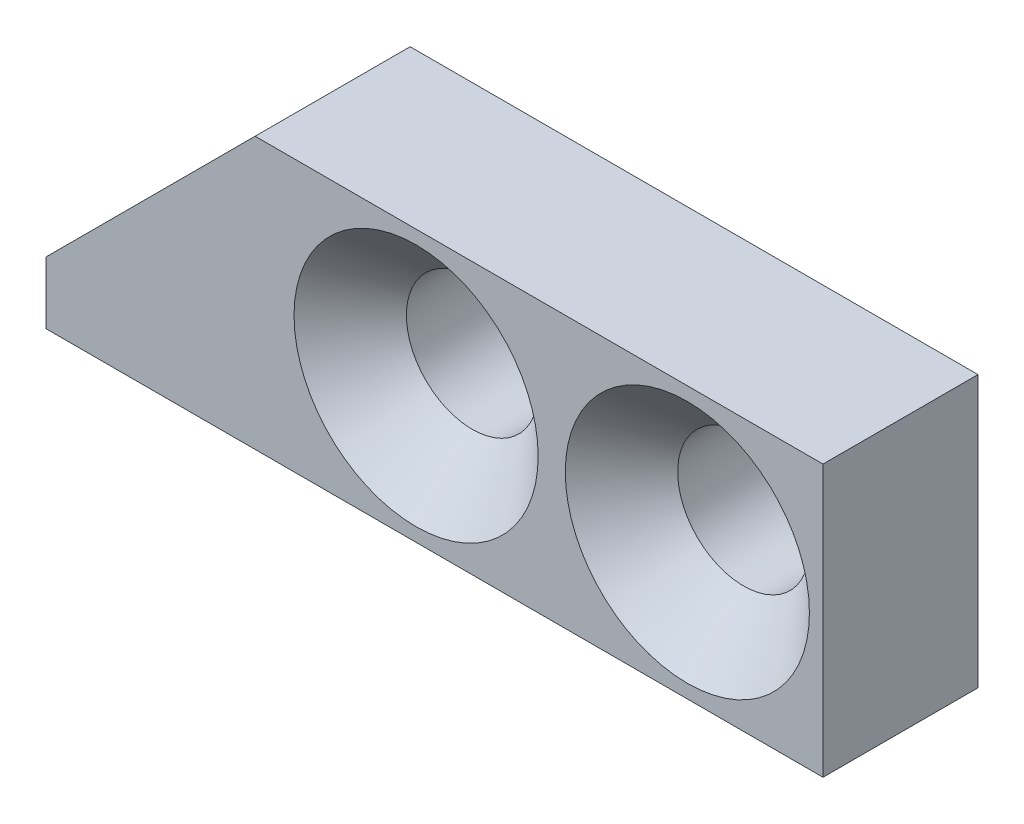
ISO-10303-21;
HEADER;
FILE_DESCRIPTION(('STEP AP214'),'2;1');
FILE_NAME('part.step','',(''),(''),'','','');
FILE_SCHEMA(('AUTOMOTIVE_DESIGN { 1 0 10303 214 1 1 1 1 }'));
ENDSEC;
DATA;
#1=APPLICATION_CONTEXT('core data for automotive mechanical design processes');
#2=APPLICATION_PROTOCOL_DEFINITION('international standard','automotive_design',2000,#1);
#3=PRODUCT_CONTEXT('',#1,'mechanical');
#4=PRODUCT('Part','Part','',(#3));
#5=PRODUCT_RELATED_PRODUCT_CATEGORY('part','',(#4));
#6=PRODUCT_DEFINITION_FORMATION('','',#4);
#7=PRODUCT_DEFINITION_CONTEXT('part definition',#1,'design');
#8=PRODUCT_DEFINITION('design','',#6,#7);
#9=PRODUCT_DEFINITION_SHAPE('','',#8);
#10=(LENGTH_UNIT() NAMED_UNIT(*) SI_UNIT(.MILLI.,.METRE.));
#11=(NAMED_UNIT(*) PLANE_ANGLE_UNIT() SI_UNIT($,.RADIAN.));
#12=(NAMED_UNIT(*) SI_UNIT($,.STERADIAN.) SOLID_ANGLE_UNIT());
#13=UNCERTAINTY_MEASURE_WITH_UNIT(LENGTH_MEASURE(1.E-05),#10,'distance_accuracy_value','');
#14=(GEOMETRIC_REPRESENTATION_CONTEXT(3) GLOBAL_UNCERTAINTY_ASSIGNED_CONTEXT((#13)) GLOBAL_UNIT_ASSIGNED_CONTEXT((#10,
#11,#12)) REPRESENTATION_CONTEXT('',''));
#15=CARTESIAN_POINT('',(0.,0.,0.));
#16=DIRECTION('',(0.,0.,1.));
#17=DIRECTION('',(1.,0.,0.));
#18=AXIS2_PLACEMENT_3D('',#15,#16,#17);
#19=CARTESIAN_POINT('',(0.,0.,4.));
#20=DIRECTION('',(1.,0.,0.));
#21=DIRECTION('',(0.,0.,-1.));
#22=AXIS2_PLACEMENT_3D('',#19,#20,#21);
#23=PLANE('',#22);
#24=DIRECTION('',(0.,-1.,0.));
#25=VECTOR('',#24,1.);
#26=CARTESIAN_POINT('',(0.,0.,0.));
#27=LINE('',#26,#25);
#28=CARTESIAN_POINT('',(0.,1.60364103295907,0.));
#29=VERTEX_POINT('',#28);
#30=CARTESIAN_POINT('',(0.,0.,0.));
#31=VERTEX_POINT('',#30);
#32=EDGE_CURVE('E111',#29,#31,#27,.T.);
#33=ORIENTED_EDGE('',*,*,#32,.T.);
#34=DIRECTION('',(0.,0.,-1.));
#35=VECTOR('',#34,1.);
#36=CARTESIAN_POINT('',(0.,0.,4.));
#37=LINE('',#36,#35);
#38=CARTESIAN_POINT('',(0.,0.,4.));
#39=VERTEX_POINT('',#38);
#40=EDGE_CURVE('E11',#39,#31,#37,.T.);
#41=ORIENTED_EDGE('',*,*,#40,.F.);
#42=DIRECTION('',(0.,-1.,0.));
#43=VECTOR('',#42,1.);
#44=CARTESIAN_POINT('',(0.,0.,4.));
#45=LINE('',#44,#43);
#46=CARTESIAN_POINT('',(0.,1.60364103295907,4.));
#47=VERTEX_POINT('',#46);
#48=EDGE_CURVE('E120',#47,#39,#45,.T.);
#49=ORIENTED_EDGE('',*,*,#48,.F.);
#50=DIRECTION('',(0.,0.,-1.));
#51=VECTOR('',#50,1.);
#52=CARTESIAN_POINT('',(0.,1.60364103295907,4.));
#53=LINE('',#52,#51);
#54=EDGE_CURVE('E107',#47,#29,#53,.T.);
#55=ORIENTED_EDGE('',*,*,#54,.T.);
#56=EDGE_LOOP('',(#33,#41,#49,#55));
#57=FACE_BOUND('',#56,.T.);
#58=ADVANCED_FACE('F37',(#57),#23,.F.);
#59=CARTESIAN_POINT('',(20.05,0.,4.));
#60=DIRECTION('',(0.,1.,0.));
#61=DIRECTION('',(0.,0.,1.));
#62=AXIS2_PLACEMENT_3D('',#59,#60,#61);
#63=PLANE('',#62);
#64=CARTESIAN_POINT('',(6.99999999999998,0.,2.));
#65=DIRECTION('',(0.,1.,0.));
#66=DIRECTION('',(-1.,0.,0.));
#67=AXIS2_PLACEMENT_3D('',#64,#65,#66);
#68=ELLIPSE('',#67,1.34350288425442,0.949999999999992);
#69=CARTESIAN_POINT('',(5.65649711574556,0.,2.));
#70=VERTEX_POINT('',#69);
#71=EDGE_CURVE('E153',#70,#70,#68,.T.);
#72=ORIENTED_EDGE('',*,*,#71,.T.);
#73=EDGE_LOOP('',(#72));
#74=FACE_BOUND('',#73,.T.);
#75=DIRECTION('',(1.,0.,0.));
#76=VECTOR('',#75,1.);
#77=CARTESIAN_POINT('',(20.05,0.,0.));
#78=LINE('',#77,#76);
#79=CARTESIAN_POINT('',(20.05,0.,0.));
#80=VERTEX_POINT('',#79);
#81=EDGE_CURVE('E114',#31,#80,#78,.T.);
#82=ORIENTED_EDGE('',*,*,#81,.T.);
#83=DIRECTION('',(0.,0.,-1.));
#84=VECTOR('',#83,1.);
#85=CARTESIAN_POINT('',(20.05,0.,4.));
#86=LINE('',#85,#84);
#87=CARTESIAN_POINT('',(20.05,0.,4.));
#88=VERTEX_POINT('',#87);
#89=EDGE_CURVE('E45',#88,#80,#86,.T.);
#90=ORIENTED_EDGE('',*,*,#89,.F.);
#91=DIRECTION('',(1.,0.,0.));
#92=VECTOR('',#91,1.);
#93=CARTESIAN_POINT('',(20.05,0.,4.));
#94=LINE('',#93,#92);
#95=EDGE_CURVE('E87',#39,#88,#94,.T.);
#96=ORIENTED_EDGE('',*,*,#95,.F.);
#97=ORIENTED_EDGE('',*,*,#40,.T.);
#98=EDGE_LOOP('',(#82,#90,#96,#97));
#99=FACE_BOUND('',#98,.T.);
#100=ADVANCED_FACE('F142',(#74,#99),#63,.F.);
#101=CARTESIAN_POINT('',(20.05,7.,4.));
#102=DIRECTION('',(-1.,0.,0.));
#103=DIRECTION('',(0.,0.,1.));
#104=AXIS2_PLACEMENT_3D('',#101,#102,#103);
#105=PLANE('',#104);
#106=DIRECTION('',(0.,1.,0.));
#107=VECTOR('',#106,1.);
#108=CARTESIAN_POINT('',(20.05,7.,0.));
#109=LINE('',#108,#107);
#110=CARTESIAN_POINT('',(20.05,7.,0.));
#111=VERTEX_POINT('',#110);
#112=EDGE_CURVE('E102',#80,#111,#109,.T.);
#113=ORIENTED_EDGE('',*,*,#112,.T.);
#114=DIRECTION('',(0.,0.,-1.));
#115=VECTOR('',#114,1.);
#116=CARTESIAN_POINT('',(20.05,7.,4.));
#117=LINE('',#116,#115);
#118=CARTESIAN_POINT('',(20.05,7.,4.));
#119=VERTEX_POINT('',#118);
#120=EDGE_CURVE('E99',#119,#111,#117,.T.);
#121=ORIENTED_EDGE('',*,*,#120,.F.);
#122=DIRECTION('',(0.,1.,0.));
#123=VECTOR('',#122,1.);
#124=CARTESIAN_POINT('',(20.05,7.,4.));
#125=LINE('',#124,#123);
#126=EDGE_CURVE('E91',#88,#119,#125,.T.);
#127=ORIENTED_EDGE('',*,*,#126,.F.);
#128=ORIENTED_EDGE('',*,*,#89,.T.);
#129=EDGE_LOOP('',(#113,#121,#127,#128));
#130=FACE_BOUND('',#129,.T.);
#131=ADVANCED_FACE('F100',(#130),#105,.F.);
#132=CARTESIAN_POINT('',(5.39635896704098,7.,4.));
#133=DIRECTION('',(0.,-1.,0.));
#134=DIRECTION('',(0.,0.,-1.));
#135=AXIS2_PLACEMENT_3D('',#132,#133,#134);
#136=PLANE('',#135);
#137=DIRECTION('',(-1.,0.,0.));
#138=VECTOR('',#137,1.);
#139=CARTESIAN_POINT('',(5.39635896704098,7.,0.));
#140=LINE('',#139,#138);
#141=CARTESIAN_POINT('',(5.39635896704098,7.,0.));
#142=VERTEX_POINT('',#141);
#143=EDGE_CURVE('E73',#111,#142,#140,.T.);
#144=ORIENTED_EDGE('',*,*,#143,.T.);
#145=DIRECTION('',(0.,0.,-1.));
#146=VECTOR('',#145,1.);
#147=CARTESIAN_POINT('',(5.39635896704098,7.,4.));
#148=LINE('',#147,#146);
#149=CARTESIAN_POINT('',(5.39635896704098,7.,4.));
#150=VERTEX_POINT('',#149);
#151=EDGE_CURVE('E103',#150,#142,#148,.T.);
#152=ORIENTED_EDGE('',*,*,#151,.F.);
#153=DIRECTION('',(-1.,0.,0.));
#154=VECTOR('',#153,1.);
#155=CARTESIAN_POINT('',(5.39635896704098,7.,4.));
#156=LINE('',#155,#154);
#157=EDGE_CURVE('E95',#119,#150,#156,.T.);
#158=ORIENTED_EDGE('',*,*,#157,.F.);
#159=ORIENTED_EDGE('',*,*,#120,.T.);
#160=EDGE_LOOP('',(#144,#152,#158,#159));
#161=FACE_BOUND('',#160,.T.);
#162=ADVANCED_FACE('F105',(#161),#136,.F.);
#163=CARTESIAN_POINT('',(0.,1.60364103295907,4.));
#164=DIRECTION('',(0.707106781186544,-0.707106781186551,0.));
#165=DIRECTION('',(0.707106781186551,0.707106781186544,0.));
#166=AXIS2_PLACEMENT_3D('',#163,#164,#165);
#167=PLANE('',#166);
#168=CARTESIAN_POINT('',(2.69817948352049,4.30182051647954,2.));
#169=DIRECTION('',(-0.707106781186544,0.707106781186551,0.));
#170=DIRECTION('',(-0.707106781186551,-0.707106781186544,0.));
#171=AXIS2_PLACEMENT_3D('',#168,#169,#170);
#172=CIRCLE('',#171,0.949999999999987);
#173=CARTESIAN_POINT('',(2.02642804139328,3.63006907435233,2.));
#174=VERTEX_POINT('',#173);
#175=EDGE_CURVE('E156',#174,#174,#172,.T.);
#176=ORIENTED_EDGE('',*,*,#175,.F.);
#177=EDGE_LOOP('',(#176));
#178=FACE_BOUND('',#177,.T.);
#179=DIRECTION('',(-0.707106781186551,-0.707106781186544,0.));
#180=VECTOR('',#179,1.);
#181=CARTESIAN_POINT('',(0.,1.60364103295907,0.));
#182=LINE('',#181,#180);
#183=EDGE_CURVE('E79',#142,#29,#182,.T.);
#184=ORIENTED_EDGE('',*,*,#183,.T.);
#185=ORIENTED_EDGE('',*,*,#54,.F.);
#186=DIRECTION('',(-0.707106781186551,-0.707106781186544,0.));
#187=VECTOR('',#186,1.);
#188=CARTESIAN_POINT('',(0.,1.60364103295907,4.));
#189=LINE('',#188,#187);
#190=EDGE_CURVE('E53',#150,#47,#189,.T.);
#191=ORIENTED_EDGE('',*,*,#190,.F.);
#192=ORIENTED_EDGE('',*,*,#151,.T.);
#193=EDGE_LOOP('',(#184,#185,#191,#192));
#194=FACE_BOUND('',#193,.T.);
#195=ADVANCED_FACE('F128',(#178,#194),#167,.F.);
#196=CARTESIAN_POINT('',(0.,0.,4.));
#197=DIRECTION('',(0.,0.,-1.));
#198=DIRECTION('',(-1.,0.,0.));
#199=AXIS2_PLACEMENT_3D('',#196,#197,#198);
#200=PLANE('',#199);
#201=CARTESIAN_POINT('',(16.55,3.5,4.));
#202=DIRECTION('',(0.,0.,1.));
#203=DIRECTION('',(1.,0.,0.));
#204=AXIS2_PLACEMENT_3D('',#201,#202,#203);
#205=CIRCLE('',#204,3.15);
#206=CARTESIAN_POINT('',(19.7,3.5,4.));
#207=VERTEX_POINT('',#206);
#208=EDGE_CURVE('E155',#207,#207,#205,.T.);
#209=ORIENTED_EDGE('',*,*,#208,.F.);
#210=EDGE_LOOP('',(#209));
#211=FACE_BOUND('',#210,.T.);
#212=CARTESIAN_POINT('',(9.55,3.5,4.));
#213=DIRECTION('',(0.,0.,1.));
#214=DIRECTION('',(1.,0.,0.));
#215=AXIS2_PLACEMENT_3D('',#212,#213,#214);
#216=CIRCLE('',#215,3.15);
#217=CARTESIAN_POINT('',(12.7,3.5,4.));
#218=VERTEX_POINT('',#217);
#219=EDGE_CURVE('E169',#218,#218,#216,.T.);
#220=ORIENTED_EDGE('',*,*,#219,.F.);
#221=EDGE_LOOP('',(#220));
#222=FACE_BOUND('',#221,.T.);
#223=ORIENTED_EDGE('',*,*,#48,.T.);
#224=ORIENTED_EDGE('',*,*,#95,.T.);
#225=ORIENTED_EDGE('',*,*,#126,.T.);
#226=ORIENTED_EDGE('',*,*,#157,.T.);
#227=ORIENTED_EDGE('',*,*,#190,.T.);
#228=EDGE_LOOP('',(#223,#224,#225,#226,#227));
#229=FACE_BOUND('',#228,.T.);
#230=ADVANCED_FACE('F93',(#211,#222,#229),#200,.F.);
#231=CARTESIAN_POINT('',(0.,0.,0.));
#232=DIRECTION('',(0.,0.,-1.));
#233=DIRECTION('',(-1.,0.,0.));
#234=AXIS2_PLACEMENT_3D('',#231,#232,#233);
#235=PLANE('',#234);
#236=CARTESIAN_POINT('',(16.55,3.5,0.));
#237=DIRECTION('',(0.,0.,1.));
#238=DIRECTION('',(1.,0.,0.));
#239=AXIS2_PLACEMENT_3D('',#236,#237,#238);
#240=CIRCLE('',#239,1.7);
#241=CARTESIAN_POINT('',(18.25,3.5,0.));
#242=VERTEX_POINT('',#241);
#243=EDGE_CURVE('E166',#242,#242,#240,.T.);
#244=ORIENTED_EDGE('',*,*,#243,.T.);
#245=EDGE_LOOP('',(#244));
#246=FACE_BOUND('',#245,.T.);
#247=CARTESIAN_POINT('',(9.55,3.5,0.));
#248=DIRECTION('',(0.,0.,1.));
#249=DIRECTION('',(1.,0.,0.));
#250=AXIS2_PLACEMENT_3D('',#247,#248,#249);
#251=CIRCLE('',#250,1.7);
#252=CARTESIAN_POINT('',(11.25,3.5,0.));
#253=VERTEX_POINT('',#252);
#254=EDGE_CURVE('E115',#253,#253,#251,.T.);
#255=ORIENTED_EDGE('',*,*,#254,.T.);
#256=EDGE_LOOP('',(#255));
#257=FACE_BOUND('',#256,.T.);
#258=ORIENTED_EDGE('',*,*,#32,.F.);
#259=ORIENTED_EDGE('',*,*,#183,.F.);
#260=ORIENTED_EDGE('',*,*,#143,.F.);
#261=ORIENTED_EDGE('',*,*,#112,.F.);
#262=ORIENTED_EDGE('',*,*,#81,.F.);
#263=EDGE_LOOP('',(#258,#259,#260,#261,#262));
#264=FACE_BOUND('',#263,.T.);
#265=ADVANCED_FACE('F124',(#246,#257,#264),#235,.T.);
#266=CARTESIAN_POINT('',(9.55,3.5,4.));
#267=DIRECTION('',(0.,0.,1.));
#268=DIRECTION('',(1.,0.,0.));
#269=AXIS2_PLACEMENT_3D('',#266,#267,#268);
#270=CYLINDRICAL_SURFACE('',#269,1.7);
#271=ORIENTED_EDGE('',*,*,#254,.F.);
#272=EDGE_LOOP('',(#271));
#273=FACE_BOUND('',#272,.T.);
#274=CARTESIAN_POINT('',(9.55,3.5,2.55));
#275=DIRECTION('',(0.,0.,1.));
#276=DIRECTION('',(1.,0.,0.));
#277=AXIS2_PLACEMENT_3D('',#274,#275,#276);
#278=CIRCLE('',#277,1.7);
#279=CARTESIAN_POINT('',(11.25,3.5,2.55));
#280=VERTEX_POINT('',#279);
#281=EDGE_CURVE('E172',#280,#280,#278,.T.);
#282=ORIENTED_EDGE('',*,*,#281,.T.);
#283=EDGE_LOOP('',(#282));
#284=FACE_BOUND('',#283,.T.);
#285=ADVANCED_FACE('F180',(#273,#284),#270,.F.);
#286=CARTESIAN_POINT('',(9.55,3.5,4.));
#287=DIRECTION('',(0.,0.,1.));
#288=DIRECTION('',(1.,0.,0.));
#289=AXIS2_PLACEMENT_3D('',#286,#287,#288);
#290=CONICAL_SURFACE('',#289,3.15,0.785398163397448);
#291=ORIENTED_EDGE('',*,*,#281,.F.);
#292=EDGE_LOOP('',(#291));
#293=FACE_BOUND('',#292,.T.);
#294=ORIENTED_EDGE('',*,*,#219,.T.);
#295=EDGE_LOOP('',(#294));
#296=FACE_BOUND('',#295,.T.);
#297=ADVANCED_FACE('F183',(#293,#296),#290,.F.);
#298=CARTESIAN_POINT('',(16.55,3.5,4.));
#299=DIRECTION('',(0.,0.,1.));
#300=DIRECTION('',(1.,0.,0.));
#301=AXIS2_PLACEMENT_3D('',#298,#299,#300);
#302=CYLINDRICAL_SURFACE('',#301,1.7);
#303=ORIENTED_EDGE('',*,*,#243,.F.);
#304=EDGE_LOOP('',(#303));
#305=FACE_BOUND('',#304,.T.);
#306=CARTESIAN_POINT('',(16.55,3.5,2.55));
#307=DIRECTION('',(0.,0.,1.));
#308=DIRECTION('',(1.,0.,0.));
#309=AXIS2_PLACEMENT_3D('',#306,#307,#308);
#310=CIRCLE('',#309,1.7);
#311=CARTESIAN_POINT('',(18.25,3.5,2.55));
#312=VERTEX_POINT('',#311);
#313=EDGE_CURVE('E159',#312,#312,#310,.T.);
#314=ORIENTED_EDGE('',*,*,#313,.T.);
#315=EDGE_LOOP('',(#314));
#316=FACE_BOUND('',#315,.T.);
#317=ADVANCED_FACE('F189',(#305,#316),#302,.F.);
#318=CARTESIAN_POINT('',(16.55,3.5,4.));
#319=DIRECTION('',(0.,0.,1.));
#320=DIRECTION('',(1.,0.,0.));
#321=AXIS2_PLACEMENT_3D('',#318,#319,#320);
#322=CONICAL_SURFACE('',#321,3.15,0.785398163397447);
#323=ORIENTED_EDGE('',*,*,#313,.F.);
#324=EDGE_LOOP('',(#323));
#325=FACE_BOUND('',#324,.T.);
#326=ORIENTED_EDGE('',*,*,#208,.T.);
#327=EDGE_LOOP('',(#326));
#328=FACE_BOUND('',#327,.T.);
#329=ADVANCED_FACE('F196',(#325,#328),#322,.F.);
#330=CARTESIAN_POINT('',(2.69817948352049,4.30182051647953,2.));
#331=DIRECTION('',(-0.707106781186544,0.707106781186551,0.));
#332=DIRECTION('',(-0.707106781186551,-0.707106781186544,0.));
#333=AXIS2_PLACEMENT_3D('',#330,#331,#332);
#334=CYLINDRICAL_SURFACE('',#333,0.949999999999992);
#335=ORIENTED_EDGE('',*,*,#175,.T.);
#336=EDGE_LOOP('',(#335));
#337=FACE_BOUND('',#336,.T.);
#338=ORIENTED_EDGE('',*,*,#71,.F.);
#339=EDGE_LOOP('',(#338));
#340=FACE_BOUND('',#339,.T.);
#341=ADVANCED_FACE('F210',(#337,#340),#334,.F.);
#342=CLOSED_SHELL('',(#58,#100,#131,#162,#195,#230,#265,#285,#297,#317,#329,#341));
#343=MANIFOLD_SOLID_BREP('B2',#342);
#344=ADVANCED_BREP_SHAPE_REPRESENTATION('',(#18,#343),#14);
#345=SHAPE_DEFINITION_REPRESENTATION(#9,#344);
ENDSEC;
END-ISO-10303-21;
